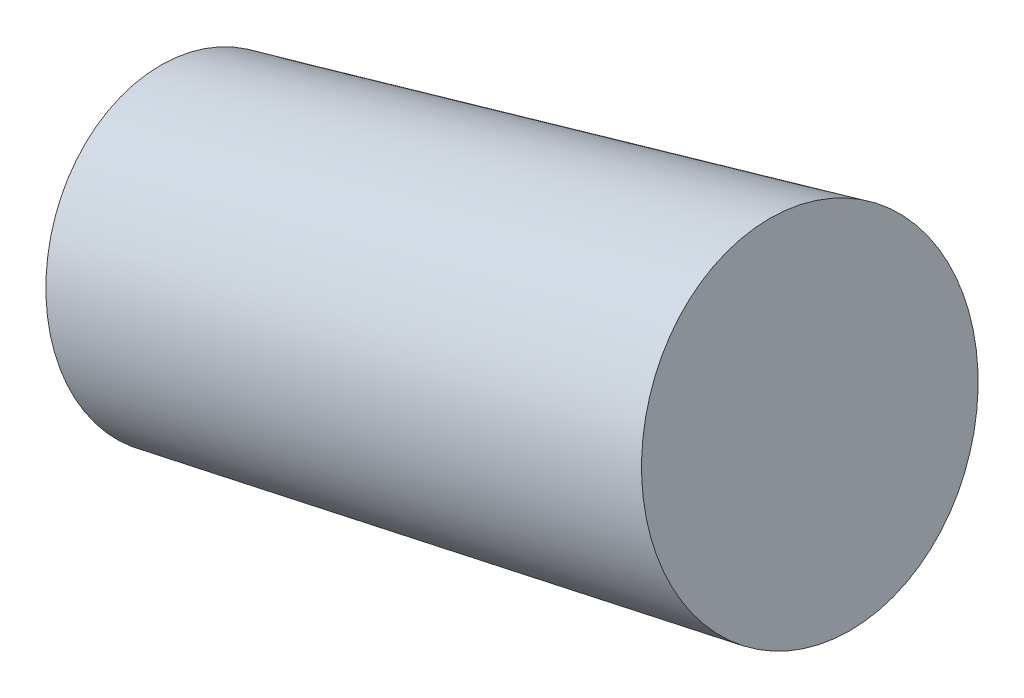
ISO-10303-21;
HEADER;
FILE_DESCRIPTION(('STEP AP214'),'2;1');
FILE_NAME('part.step','',(''),(''),'','','');
FILE_SCHEMA(('AUTOMOTIVE_DESIGN { 1 0 10303 214 1 1 1 1 }'));
ENDSEC;
DATA;
#1=APPLICATION_CONTEXT('core data for automotive mechanical design processes');
#2=APPLICATION_PROTOCOL_DEFINITION('international standard','automotive_design',2000,#1);
#3=PRODUCT_CONTEXT('',#1,'mechanical');
#4=PRODUCT('Part','Part','',(#3));
#5=PRODUCT_RELATED_PRODUCT_CATEGORY('part','',(#4));
#6=PRODUCT_DEFINITION_FORMATION('','',#4);
#7=PRODUCT_DEFINITION_CONTEXT('part definition',#1,'design');
#8=PRODUCT_DEFINITION('design','',#6,#7);
#9=PRODUCT_DEFINITION_SHAPE('','',#8);
#10=(LENGTH_UNIT() NAMED_UNIT(*) SI_UNIT(.MILLI.,.METRE.));
#11=(NAMED_UNIT(*) PLANE_ANGLE_UNIT() SI_UNIT($,.RADIAN.));
#12=(NAMED_UNIT(*) SI_UNIT($,.STERADIAN.) SOLID_ANGLE_UNIT());
#13=UNCERTAINTY_MEASURE_WITH_UNIT(LENGTH_MEASURE(1.E-05),#10,'distance_accuracy_value','');
#14=(GEOMETRIC_REPRESENTATION_CONTEXT(3) GLOBAL_UNCERTAINTY_ASSIGNED_CONTEXT((#13)) GLOBAL_UNIT_ASSIGNED_CONTEXT((#10,
#11,#12)) REPRESENTATION_CONTEXT('',''));
#15=CARTESIAN_POINT('',(0.,0.,0.));
#16=DIRECTION('',(0.,0.,1.));
#17=DIRECTION('',(1.,0.,0.));
#18=AXIS2_PLACEMENT_3D('',#15,#16,#17);
#19=CARTESIAN_POINT('',(14.4511026398226,38.2281995710438,-3.74838350318479));
#20=DIRECTION('',(0.969374666241263,0.245586555922023,0.));
#21=DIRECTION('',(0.,0.,1.));
#22=AXIS2_PLACEMENT_3D('',#19,#20,#21);
#23=PLANE('',#22);
#24=CARTESIAN_POINT('',(15.37165530546,34.594611284179,0.));
#25=DIRECTION('',(0.969374666241263,0.245586555922023,0.));
#26=DIRECTION('',(0.245586555922023,-0.969374666241263,0.));
#27=AXIS2_PLACEMENT_3D('',#24,#25,#26);
#28=CIRCLE('',#27,3.74838350318477);
#29=CARTESIAN_POINT('',(16.292207900282,30.961023276835,0.));
#30=VERTEX_POINT('',#29);
#31=EDGE_CURVE('E21',#30,#30,#28,.F.);
#32=ORIENTED_EDGE('',*,*,#31,.F.);
#33=EDGE_LOOP('',(#32));
#34=FACE_BOUND('',#33,.T.);
#35=ADVANCED_FACE('F14',(#34),#23,.T.);
#36=CARTESIAN_POINT('',(2.13593029707189,27.7751816113411,-3.3600660806964));
#37=DIRECTION('',(-0.969374666241263,-0.245586555922023,0.));
#38=DIRECTION('',(0.,0.,1.));
#39=AXIS2_PLACEMENT_3D('',#36,#37,#38);
#40=PLANE('',#39);
#41=CARTESIAN_POINT('',(1.3107432007537,31.032344704316,0.));
#42=DIRECTION('',(-0.969374666241263,-0.245586555922023,0.));
#43=DIRECTION('',(-0.24558655592202,0.969374666241253,-1.41721940911557E-07));
#44=AXIS2_PLACEMENT_3D('',#41,#42,#43);
#45=CIRCLE('',#44,3.36006624312192);
#46=CARTESIAN_POINT('',(0.485556104435542,34.2895077972908,-4.76195109566643E-07));
#47=VERTEX_POINT('',#46);
#48=EDGE_CURVE('E10',#47,#47,#45,.T.);
#49=ORIENTED_EDGE('',*,*,#48,.T.);
#50=EDGE_LOOP('',(#49));
#51=FACE_BOUND('',#50,.T.);
#52=ADVANCED_FACE('F29',(#51),#40,.T.);
#53=CARTESIAN_POINT('',(15.37165530546,34.594611284179,0.));
#54=DIRECTION('',(0.969374666241263,0.245586555922023,0.));
#55=DIRECTION('',(0.245586555922023,-0.969374666241263,0.));
#56=AXIS2_PLACEMENT_3D('',#53,#54,#55);
#57=CONICAL_SURFACE('',#56,3.74838350318477,0.0267646240793403);
#58=ORIENTED_EDGE('',*,*,#48,.F.);
#59=EDGE_LOOP('',(#58));
#60=FACE_BOUND('',#59,.T.);
#61=ORIENTED_EDGE('',*,*,#31,.T.);
#62=EDGE_LOOP('',(#61));
#63=FACE_BOUND('',#62,.T.);
#64=ADVANCED_FACE('F16',(#60,#63),#57,.T.);
#65=CLOSED_SHELL('',(#35,#52,#64));
#66=MANIFOLD_SOLID_BREP('B1',#65);
#67=ADVANCED_BREP_SHAPE_REPRESENTATION('',(#18,#66),#14);
#68=SHAPE_DEFINITION_REPRESENTATION(#9,#67);
ENDSEC;
END-ISO-10303-21;
